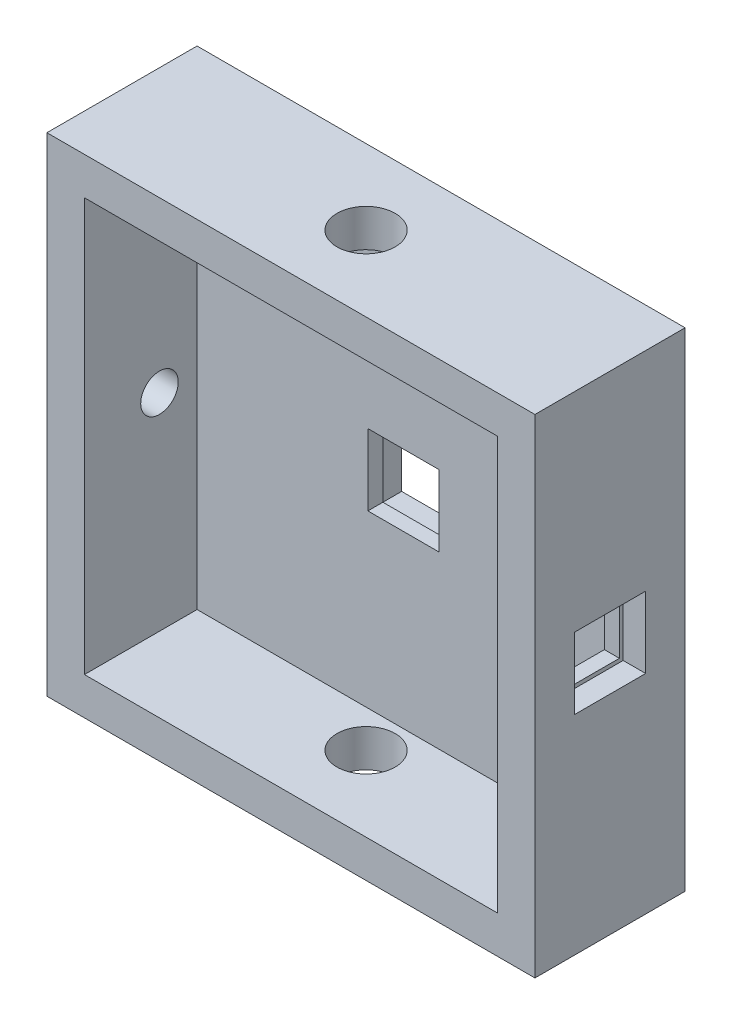
ISO-10303-21;
HEADER;
FILE_DESCRIPTION(('STEP AP214'),'2;1');
FILE_NAME('part.step','',(''),(''),'','','');
FILE_SCHEMA(('AUTOMOTIVE_DESIGN { 1 0 10303 214 1 1 1 1 }'));
ENDSEC;
DATA;
#1=APPLICATION_CONTEXT('core data for automotive mechanical design processes');
#2=APPLICATION_PROTOCOL_DEFINITION('international standard','automotive_design',2000,#1);
#3=PRODUCT_CONTEXT('',#1,'mechanical');
#4=PRODUCT('Part','Part','',(#3));
#5=PRODUCT_RELATED_PRODUCT_CATEGORY('part','',(#4));
#6=PRODUCT_DEFINITION_FORMATION('','',#4);
#7=PRODUCT_DEFINITION_CONTEXT('part definition',#1,'design');
#8=PRODUCT_DEFINITION('design','',#6,#7);
#9=PRODUCT_DEFINITION_SHAPE('','',#8);
#10=(LENGTH_UNIT() NAMED_UNIT(*) SI_UNIT(.MILLI.,.METRE.));
#11=(NAMED_UNIT(*) PLANE_ANGLE_UNIT() SI_UNIT($,.RADIAN.));
#12=(NAMED_UNIT(*) SI_UNIT($,.STERADIAN.) SOLID_ANGLE_UNIT());
#13=UNCERTAINTY_MEASURE_WITH_UNIT(LENGTH_MEASURE(1.E-05),#10,'distance_accuracy_value','');
#14=(GEOMETRIC_REPRESENTATION_CONTEXT(3) GLOBAL_UNCERTAINTY_ASSIGNED_CONTEXT((#13)) GLOBAL_UNIT_ASSIGNED_CONTEXT((#10,
#11,#12)) REPRESENTATION_CONTEXT('',''));
#15=CARTESIAN_POINT('',(0.,0.,0.));
#16=DIRECTION('',(0.,0.,1.));
#17=DIRECTION('',(1.,0.,0.));
#18=AXIS2_PLACEMENT_3D('',#15,#16,#17);
#19=CARTESIAN_POINT('',(11.,-1.7,5.7));
#20=DIRECTION('',(0.,0.,-1.));
#21=DIRECTION('',(-1.,0.,0.));
#22=AXIS2_PLACEMENT_3D('',#19,#20,#21);
#23=PLANE('',#22);
#24=DIRECTION('',(1.,0.,0.));
#25=VECTOR('',#24,1.);
#26=CARTESIAN_POINT('',(11.,1.7,5.7));
#27=LINE('',#26,#25);
#28=CARTESIAN_POINT('',(11.,1.7,5.7));
#29=VERTEX_POINT('',#28);
#30=CARTESIAN_POINT('',(11.8,1.7,5.7));
#31=VERTEX_POINT('',#30);
#32=EDGE_CURVE('E230',#29,#31,#27,.T.);
#33=ORIENTED_EDGE('',*,*,#32,.T.);
#34=DIRECTION('',(0.,-1.,0.));
#35=VECTOR('',#34,1.);
#36=CARTESIAN_POINT('',(11.8,-1.7,5.7));
#37=LINE('',#36,#35);
#38=CARTESIAN_POINT('',(11.8,-1.7,5.7));
#39=VERTEX_POINT('',#38);
#40=EDGE_CURVE('E209',#31,#39,#37,.T.);
#41=ORIENTED_EDGE('',*,*,#40,.T.);
#42=DIRECTION('',(1.,0.,0.));
#43=VECTOR('',#42,1.);
#44=CARTESIAN_POINT('',(11.,-1.7,5.7));
#45=LINE('',#44,#43);
#46=CARTESIAN_POINT('',(11.,-1.7,5.7));
#47=VERTEX_POINT('',#46);
#48=EDGE_CURVE('E236',#47,#39,#45,.T.);
#49=ORIENTED_EDGE('',*,*,#48,.F.);
#50=DIRECTION('',(0.,1.,0.));
#51=VECTOR('',#50,1.);
#52=CARTESIAN_POINT('',(11.,-1.7,5.7));
#53=LINE('',#52,#51);
#54=EDGE_CURVE('E838',#47,#29,#53,.T.);
#55=ORIENTED_EDGE('',*,*,#54,.T.);
#56=EDGE_LOOP('',(#33,#41,#49,#55));
#57=FACE_BOUND('',#56,.T.);
#58=ADVANCED_FACE('F45',(#57),#23,.T.);
#59=CARTESIAN_POINT('',(11.,1.7,5.7));
#60=DIRECTION('',(0.,-1.,0.));
#61=DIRECTION('',(1.,0.,0.));
#62=AXIS2_PLACEMENT_3D('',#59,#60,#61);
#63=PLANE('',#62);
#64=DIRECTION('',(1.,0.,0.));
#65=VECTOR('',#64,1.);
#66=CARTESIAN_POINT('',(11.,1.7,2.3));
#67=LINE('',#66,#65);
#68=CARTESIAN_POINT('',(11.,1.7,2.3));
#69=VERTEX_POINT('',#68);
#70=CARTESIAN_POINT('',(11.8,1.7,2.3));
#71=VERTEX_POINT('',#70);
#72=EDGE_CURVE('E220',#69,#71,#67,.T.);
#73=ORIENTED_EDGE('',*,*,#72,.T.);
#74=DIRECTION('',(0.,0.,1.));
#75=VECTOR('',#74,1.);
#76=CARTESIAN_POINT('',(11.8,1.7,5.7));
#77=LINE('',#76,#75);
#78=EDGE_CURVE('E205',#71,#31,#77,.T.);
#79=ORIENTED_EDGE('',*,*,#78,.T.);
#80=ORIENTED_EDGE('',*,*,#32,.F.);
#81=DIRECTION('',(0.,0.,-1.));
#82=VECTOR('',#81,1.);
#83=CARTESIAN_POINT('',(11.,1.7,5.7));
#84=LINE('',#83,#82);
#85=EDGE_CURVE('E228',#29,#69,#84,.T.);
#86=ORIENTED_EDGE('',*,*,#85,.T.);
#87=EDGE_LOOP('',(#73,#79,#80,#86));
#88=FACE_BOUND('',#87,.T.);
#89=ADVANCED_FACE('F226',(#88),#63,.T.);
#90=CARTESIAN_POINT('',(11.,-1.7,2.3));
#91=DIRECTION('',(0.,0.,-1.));
#92=DIRECTION('',(-1.,0.,0.));
#93=AXIS2_PLACEMENT_3D('',#90,#91,#92);
#94=PLANE('',#93);
#95=DIRECTION('',(0.,1.,0.));
#96=VECTOR('',#95,1.);
#97=CARTESIAN_POINT('',(11.8,-1.7,2.3));
#98=LINE('',#97,#96);
#99=CARTESIAN_POINT('',(11.8,-1.7,2.3));
#100=VERTEX_POINT('',#99);
#101=EDGE_CURVE('E70',#100,#71,#98,.T.);
#102=ORIENTED_EDGE('',*,*,#101,.T.);
#103=ORIENTED_EDGE('',*,*,#72,.F.);
#104=DIRECTION('',(0.,1.,0.));
#105=VECTOR('',#104,1.);
#106=CARTESIAN_POINT('',(11.,-1.7,2.3));
#107=LINE('',#106,#105);
#108=CARTESIAN_POINT('',(11.,-1.7,2.3));
#109=VERTEX_POINT('',#108);
#110=EDGE_CURVE('E839',#109,#69,#107,.T.);
#111=ORIENTED_EDGE('',*,*,#110,.F.);
#112=DIRECTION('',(1.,0.,0.));
#113=VECTOR('',#112,1.);
#114=CARTESIAN_POINT('',(11.,-1.7,2.3));
#115=LINE('',#114,#113);
#116=EDGE_CURVE('E223',#109,#100,#115,.T.);
#117=ORIENTED_EDGE('',*,*,#116,.T.);
#118=EDGE_LOOP('',(#102,#103,#111,#117));
#119=FACE_BOUND('',#118,.T.);
#120=ADVANCED_FACE('F219',(#119),#94,.F.);
#121=CARTESIAN_POINT('',(11.,-1.7,5.7));
#122=DIRECTION('',(0.,-1.,0.));
#123=DIRECTION('',(1.,0.,0.));
#124=AXIS2_PLACEMENT_3D('',#121,#122,#123);
#125=PLANE('',#124);
#126=DIRECTION('',(0.,0.,-1.));
#127=VECTOR('',#126,1.);
#128=CARTESIAN_POINT('',(11.8,-1.7,5.7));
#129=LINE('',#128,#127);
#130=EDGE_CURVE('E854',#39,#100,#129,.T.);
#131=ORIENTED_EDGE('',*,*,#130,.T.);
#132=ORIENTED_EDGE('',*,*,#116,.F.);
#133=DIRECTION('',(0.,0.,-1.));
#134=VECTOR('',#133,1.);
#135=CARTESIAN_POINT('',(11.,-1.7,5.7));
#136=LINE('',#135,#134);
#137=EDGE_CURVE('E844',#47,#109,#136,.T.);
#138=ORIENTED_EDGE('',*,*,#137,.F.);
#139=ORIENTED_EDGE('',*,*,#48,.T.);
#140=EDGE_LOOP('',(#131,#132,#138,#139));
#141=FACE_BOUND('',#140,.T.);
#142=ADVANCED_FACE('F613',(#141),#125,.F.);
#143=CARTESIAN_POINT('',(13.,-13.,8.));
#144=DIRECTION('',(-1.,0.,0.));
#145=DIRECTION('',(0.,-1.,0.));
#146=AXIS2_PLACEMENT_3D('',#143,#144,#145);
#147=PLANE('',#146);
#148=DIRECTION('',(0.,1.,0.));
#149=VECTOR('',#148,1.);
#150=CARTESIAN_POINT('',(13.,-1.9,2.1));
#151=LINE('',#150,#149);
#152=CARTESIAN_POINT('',(13.,-1.9,2.1));
#153=VERTEX_POINT('',#152);
#154=CARTESIAN_POINT('',(13.,1.9,2.1));
#155=VERTEX_POINT('',#154);
#156=EDGE_CURVE('E880',#153,#155,#151,.T.);
#157=ORIENTED_EDGE('',*,*,#156,.F.);
#158=DIRECTION('',(0.,0.,-1.));
#159=VECTOR('',#158,1.);
#160=CARTESIAN_POINT('',(13.,-1.9,5.9));
#161=LINE('',#160,#159);
#162=CARTESIAN_POINT('',(13.,-1.9,5.9));
#163=VERTEX_POINT('',#162);
#164=EDGE_CURVE('E62',#163,#153,#161,.T.);
#165=ORIENTED_EDGE('',*,*,#164,.F.);
#166=DIRECTION('',(0.,-1.,0.));
#167=VECTOR('',#166,1.);
#168=CARTESIAN_POINT('',(13.,-1.9,5.9));
#169=LINE('',#168,#167);
#170=CARTESIAN_POINT('',(13.,1.9,5.9));
#171=VERTEX_POINT('',#170);
#172=EDGE_CURVE('E865',#171,#163,#169,.T.);
#173=ORIENTED_EDGE('',*,*,#172,.F.);
#174=DIRECTION('',(0.,0.,1.));
#175=VECTOR('',#174,1.);
#176=CARTESIAN_POINT('',(13.,1.9,5.9));
#177=LINE('',#176,#175);
#178=EDGE_CURVE('E884',#155,#171,#177,.T.);
#179=ORIENTED_EDGE('',*,*,#178,.F.);
#180=EDGE_LOOP('',(#157,#165,#173,#179));
#181=FACE_BOUND('',#180,.T.);
#182=DIRECTION('',(0.,1.,0.));
#183=VECTOR('',#182,1.);
#184=CARTESIAN_POINT('',(13.,-13.,0.));
#185=LINE('',#184,#183);
#186=CARTESIAN_POINT('',(13.,-13.,0.));
#187=VERTEX_POINT('',#186);
#188=CARTESIAN_POINT('',(13.,13.,0.));
#189=VERTEX_POINT('',#188);
#190=EDGE_CURVE('E391',#187,#189,#185,.T.);
#191=ORIENTED_EDGE('',*,*,#190,.T.);
#192=DIRECTION('',(0.,0.,-1.));
#193=VECTOR('',#192,1.);
#194=CARTESIAN_POINT('',(13.,13.,8.));
#195=LINE('',#194,#193);
#196=CARTESIAN_POINT('',(13.,13.,8.));
#197=VERTEX_POINT('',#196);
#198=EDGE_CURVE('E406',#197,#189,#195,.T.);
#199=ORIENTED_EDGE('',*,*,#198,.F.);
#200=DIRECTION('',(0.,1.,0.));
#201=VECTOR('',#200,1.);
#202=CARTESIAN_POINT('',(13.,-13.,8.));
#203=LINE('',#202,#201);
#204=CARTESIAN_POINT('',(13.,-13.,8.));
#205=VERTEX_POINT('',#204);
#206=EDGE_CURVE('E377',#205,#197,#203,.T.);
#207=ORIENTED_EDGE('',*,*,#206,.F.);
#208=DIRECTION('',(0.,0.,-1.));
#209=VECTOR('',#208,1.);
#210=CARTESIAN_POINT('',(13.,-13.,8.));
#211=LINE('',#210,#209);
#212=EDGE_CURVE('E410',#205,#187,#211,.T.);
#213=ORIENTED_EDGE('',*,*,#212,.T.);
#214=EDGE_LOOP('',(#191,#199,#207,#213));
#215=FACE_BOUND('',#214,.T.);
#216=ADVANCED_FACE('F621',(#181,#215),#147,.F.);
#217=CARTESIAN_POINT('',(11.,-11.,8.));
#218=DIRECTION('',(-1.,0.,0.));
#219=DIRECTION('',(0.,0.,1.));
#220=AXIS2_PLACEMENT_3D('',#217,#218,#219);
#221=PLANE('',#220);
#222=DIRECTION('',(0.,1.,0.));
#223=VECTOR('',#222,1.);
#224=CARTESIAN_POINT('',(11.,0.,2.));
#225=LINE('',#224,#223);
#226=CARTESIAN_POINT('',(11.,-11.,2.));
#227=VERTEX_POINT('',#226);
#228=CARTESIAN_POINT('',(11.,11.,2.));
#229=VERTEX_POINT('',#228);
#230=EDGE_CURVE('E334',#227,#229,#225,.T.);
#231=ORIENTED_EDGE('',*,*,#230,.F.);
#232=DIRECTION('',(0.,0.,-1.));
#233=VECTOR('',#232,1.);
#234=CARTESIAN_POINT('',(11.,-11.,8.));
#235=LINE('',#234,#233);
#236=CARTESIAN_POINT('',(11.,-11.,8.));
#237=VERTEX_POINT('',#236);
#238=EDGE_CURVE('E357',#237,#227,#235,.T.);
#239=ORIENTED_EDGE('',*,*,#238,.F.);
#240=DIRECTION('',(0.,1.,0.));
#241=VECTOR('',#240,1.);
#242=CARTESIAN_POINT('',(11.,-11.,8.));
#243=LINE('',#242,#241);
#244=CARTESIAN_POINT('',(11.,11.,8.));
#245=VERTEX_POINT('',#244);
#246=EDGE_CURVE('E344',#237,#245,#243,.T.);
#247=ORIENTED_EDGE('',*,*,#246,.T.);
#248=DIRECTION('',(0.,0.,-1.));
#249=VECTOR('',#248,1.);
#250=CARTESIAN_POINT('',(11.,11.,8.));
#251=LINE('',#250,#249);
#252=EDGE_CURVE('E368',#245,#229,#251,.T.);
#253=ORIENTED_EDGE('',*,*,#252,.T.);
#254=EDGE_LOOP('',(#231,#239,#247,#253));
#255=FACE_BOUND('',#254,.T.);
#256=ORIENTED_EDGE('',*,*,#85,.F.);
#257=ORIENTED_EDGE('',*,*,#54,.F.);
#258=ORIENTED_EDGE('',*,*,#137,.T.);
#259=ORIENTED_EDGE('',*,*,#110,.T.);
#260=EDGE_LOOP('',(#256,#257,#258,#259));
#261=FACE_BOUND('',#260,.T.);
#262=ADVANCED_FACE('F631',(#255,#261),#221,.T.);
#263=CARTESIAN_POINT('',(0.,0.,0.));
#264=DIRECTION('',(0.,0.,1.));
#265=DIRECTION('',(1.,0.,0.));
#266=AXIS2_PLACEMENT_3D('',#263,#264,#265);
#267=PLANE('',#266);
#268=DIRECTION('',(1.,0.,0.));
#269=VECTOR('',#268,1.);
#270=CARTESIAN_POINT('',(-13.,-13.,0.));
#271=LINE('',#270,#269);
#272=CARTESIAN_POINT('',(-13.,-13.,0.));
#273=VERTEX_POINT('',#272);
#274=EDGE_CURVE('E372',#273,#187,#271,.T.);
#275=ORIENTED_EDGE('',*,*,#274,.F.);
#276=DIRECTION('',(0.,-1.,0.));
#277=VECTOR('',#276,1.);
#278=CARTESIAN_POINT('',(-13.,-13.,0.));
#279=LINE('',#278,#277);
#280=CARTESIAN_POINT('',(-13.,13.,0.));
#281=VERTEX_POINT('',#280);
#282=EDGE_CURVE('E378',#281,#273,#279,.T.);
#283=ORIENTED_EDGE('',*,*,#282,.F.);
#284=DIRECTION('',(-1.,0.,0.));
#285=VECTOR('',#284,1.);
#286=CARTESIAN_POINT('',(-13.,13.,0.));
#287=LINE('',#286,#285);
#288=EDGE_CURVE('E394',#189,#281,#287,.T.);
#289=ORIENTED_EDGE('',*,*,#288,.F.);
#290=ORIENTED_EDGE('',*,*,#190,.F.);
#291=EDGE_LOOP('',(#275,#283,#289,#290));
#292=FACE_BOUND('',#291,.T.);
#293=DIRECTION('',(0.,1.,0.));
#294=VECTOR('',#293,1.);
#295=CARTESIAN_POINT('',(2.1,-2.1,0.));
#296=LINE('',#295,#294);
#297=CARTESIAN_POINT('',(2.1,-2.1,0.));
#298=VERTEX_POINT('',#297);
#299=CARTESIAN_POINT('',(2.1,2.1,0.));
#300=VERTEX_POINT('',#299);
#301=EDGE_CURVE('E278',#298,#300,#296,.T.);
#302=ORIENTED_EDGE('',*,*,#301,.T.);
#303=DIRECTION('',(-1.,0.,0.));
#304=VECTOR('',#303,1.);
#305=CARTESIAN_POINT('',(-2.1,2.1,0.));
#306=LINE('',#305,#304);
#307=CARTESIAN_POINT('',(-2.1,2.1,0.));
#308=VERTEX_POINT('',#307);
#309=EDGE_CURVE('E306',#300,#308,#306,.T.);
#310=ORIENTED_EDGE('',*,*,#309,.T.);
#311=DIRECTION('',(0.,-1.,0.));
#312=VECTOR('',#311,1.);
#313=CARTESIAN_POINT('',(-2.1,-2.1,0.));
#314=LINE('',#313,#312);
#315=CARTESIAN_POINT('',(-2.1,-2.1,0.));
#316=VERTEX_POINT('',#315);
#317=EDGE_CURVE('E310',#308,#316,#314,.T.);
#318=ORIENTED_EDGE('',*,*,#317,.T.);
#319=DIRECTION('',(1.,0.,0.));
#320=VECTOR('',#319,1.);
#321=CARTESIAN_POINT('',(-2.1,-2.1,0.));
#322=LINE('',#321,#320);
#323=EDGE_CURVE('E293',#316,#298,#322,.T.);
#324=ORIENTED_EDGE('',*,*,#323,.T.);
#325=EDGE_LOOP('',(#302,#310,#318,#324));
#326=FACE_BOUND('',#325,.T.);
#327=ADVANCED_FACE('F462',(#292,#326),#267,.F.);
#328=CARTESIAN_POINT('',(0.,0.,8.));
#329=DIRECTION('',(0.,0.,1.));
#330=DIRECTION('',(1.,0.,0.));
#331=AXIS2_PLACEMENT_3D('',#328,#329,#330);
#332=PLANE('',#331);
#333=DIRECTION('',(1.,0.,0.));
#334=VECTOR('',#333,1.);
#335=CARTESIAN_POINT('',(-13.,-13.,8.));
#336=LINE('',#335,#334);
#337=CARTESIAN_POINT('',(-13.,-13.,8.));
#338=VERTEX_POINT('',#337);
#339=EDGE_CURVE('E373',#338,#205,#336,.T.);
#340=ORIENTED_EDGE('',*,*,#339,.T.);
#341=ORIENTED_EDGE('',*,*,#206,.T.);
#342=DIRECTION('',(-1.,0.,0.));
#343=VECTOR('',#342,1.);
#344=CARTESIAN_POINT('',(-13.,13.,8.));
#345=LINE('',#344,#343);
#346=CARTESIAN_POINT('',(-13.,13.,8.));
#347=VERTEX_POINT('',#346);
#348=EDGE_CURVE('E381',#197,#347,#345,.T.);
#349=ORIENTED_EDGE('',*,*,#348,.T.);
#350=DIRECTION('',(0.,-1.,0.));
#351=VECTOR('',#350,1.);
#352=CARTESIAN_POINT('',(-13.,-13.,8.));
#353=LINE('',#352,#351);
#354=EDGE_CURVE('E384',#347,#338,#353,.T.);
#355=ORIENTED_EDGE('',*,*,#354,.T.);
#356=EDGE_LOOP('',(#340,#341,#349,#355));
#357=FACE_BOUND('',#356,.T.);
#358=DIRECTION('',(-1.,0.,0.));
#359=VECTOR('',#358,1.);
#360=CARTESIAN_POINT('',(-11.,11.,8.));
#361=LINE('',#360,#359);
#362=CARTESIAN_POINT('',(-11.,11.,8.));
#363=VERTEX_POINT('',#362);
#364=EDGE_CURVE('E347',#245,#363,#361,.T.);
#365=ORIENTED_EDGE('',*,*,#364,.F.);
#366=ORIENTED_EDGE('',*,*,#246,.F.);
#367=DIRECTION('',(1.,0.,0.));
#368=VECTOR('',#367,1.);
#369=CARTESIAN_POINT('',(-11.,-11.,8.));
#370=LINE('',#369,#368);
#371=CARTESIAN_POINT('',(-11.,-11.,8.));
#372=VERTEX_POINT('',#371);
#373=EDGE_CURVE('E354',#372,#237,#370,.T.);
#374=ORIENTED_EDGE('',*,*,#373,.F.);
#375=DIRECTION('',(0.,-1.,0.));
#376=VECTOR('',#375,1.);
#377=CARTESIAN_POINT('',(-11.,-11.,8.));
#378=LINE('',#377,#376);
#379=EDGE_CURVE('E350',#363,#372,#378,.T.);
#380=ORIENTED_EDGE('',*,*,#379,.F.);
#381=EDGE_LOOP('',(#365,#366,#374,#380));
#382=FACE_BOUND('',#381,.T.);
#383=ADVANCED_FACE('F712',(#357,#382),#332,.T.);
#384=CARTESIAN_POINT('',(-13.,-13.,8.));
#385=DIRECTION('',(0.,1.,0.));
#386=DIRECTION('',(0.,0.,1.));
#387=AXIS2_PLACEMENT_3D('',#384,#385,#386);
#388=PLANE('',#387);
#389=CARTESIAN_POINT('',(-0.00435538032722213,-13.,3.99223783635204));
#390=DIRECTION('',(0.,1.,0.));
#391=DIRECTION('',(-1.,0.,0.));
#392=AXIS2_PLACEMENT_3D('',#389,#390,#391);
#393=CIRCLE('',#392,1.55);
#394=CARTESIAN_POINT('',(-1.55435538032722,-13.,3.99223783635204));
#395=VERTEX_POINT('',#394);
#396=EDGE_CURVE('E248',#395,#395,#393,.T.);
#397=ORIENTED_EDGE('',*,*,#396,.T.);
#398=EDGE_LOOP('',(#397));
#399=FACE_BOUND('',#398,.T.);
#400=ORIENTED_EDGE('',*,*,#274,.T.);
#401=ORIENTED_EDGE('',*,*,#212,.F.);
#402=ORIENTED_EDGE('',*,*,#339,.F.);
#403=DIRECTION('',(0.,0.,-1.));
#404=VECTOR('',#403,1.);
#405=CARTESIAN_POINT('',(-13.,-13.,8.));
#406=LINE('',#405,#404);
#407=EDGE_CURVE('E387',#338,#273,#406,.T.);
#408=ORIENTED_EDGE('',*,*,#407,.T.);
#409=EDGE_LOOP('',(#400,#401,#402,#408));
#410=FACE_BOUND('',#409,.T.);
#411=ADVANCED_FACE('F47',(#399,#410),#388,.F.);
#412=CARTESIAN_POINT('',(-13.,13.,8.));
#413=DIRECTION('',(0.,-1.,0.));
#414=DIRECTION('',(1.,0.,0.));
#415=AXIS2_PLACEMENT_3D('',#412,#413,#414);
#416=PLANE('',#415);
#417=CARTESIAN_POINT('',(-0.00435538032722387,13.,3.99223783635204));
#418=DIRECTION('',(0.,1.,0.));
#419=DIRECTION('',(-1.,0.,0.));
#420=AXIS2_PLACEMENT_3D('',#417,#418,#419);
#421=CIRCLE('',#420,1.55);
#422=CARTESIAN_POINT('',(-1.55435538032722,13.,3.99223783635204));
#423=VERTEX_POINT('',#422);
#424=EDGE_CURVE('E244',#423,#423,#421,.T.);
#425=ORIENTED_EDGE('',*,*,#424,.F.);
#426=EDGE_LOOP('',(#425));
#427=FACE_BOUND('',#426,.T.);
#428=ORIENTED_EDGE('',*,*,#288,.T.);
#429=DIRECTION('',(0.,0.,-1.));
#430=VECTOR('',#429,1.);
#431=CARTESIAN_POINT('',(-13.,13.,8.));
#432=LINE('',#431,#430);
#433=EDGE_CURVE('E402',#347,#281,#432,.T.);
#434=ORIENTED_EDGE('',*,*,#433,.F.);
#435=ORIENTED_EDGE('',*,*,#348,.F.);
#436=ORIENTED_EDGE('',*,*,#198,.T.);
#437=EDGE_LOOP('',(#428,#434,#435,#436));
#438=FACE_BOUND('',#437,.T.);
#439=ADVANCED_FACE('F761',(#427,#438),#416,.F.);
#440=CARTESIAN_POINT('',(-13.,-13.,8.));
#441=DIRECTION('',(1.,0.,0.));
#442=DIRECTION('',(0.,0.,-1.));
#443=AXIS2_PLACEMENT_3D('',#440,#441,#442);
#444=PLANE('',#443);
#445=CARTESIAN_POINT('',(-13.,0.00439716610721987,4.0022983558996));
#446=DIRECTION('',(-1.,0.,0.));
#447=DIRECTION('',(0.,0.,1.));
#448=AXIS2_PLACEMENT_3D('',#445,#446,#447);
#449=CIRCLE('',#448,1.);
#450=CARTESIAN_POINT('',(-13.,0.00439716610721987,5.0022983558996));
#451=VERTEX_POINT('',#450);
#452=EDGE_CURVE('E234',#451,#451,#449,.T.);
#453=ORIENTED_EDGE('',*,*,#452,.F.);
#454=EDGE_LOOP('',(#453));
#455=FACE_BOUND('',#454,.T.);
#456=ORIENTED_EDGE('',*,*,#282,.T.);
#457=ORIENTED_EDGE('',*,*,#407,.F.);
#458=ORIENTED_EDGE('',*,*,#354,.F.);
#459=ORIENTED_EDGE('',*,*,#433,.T.);
#460=EDGE_LOOP('',(#456,#457,#458,#459));
#461=FACE_BOUND('',#460,.T.);
#462=ADVANCED_FACE('F751',(#455,#461),#444,.F.);
#463=CARTESIAN_POINT('',(-11.,11.,8.));
#464=DIRECTION('',(0.,-1.,0.));
#465=DIRECTION('',(0.,0.,-1.));
#466=AXIS2_PLACEMENT_3D('',#463,#464,#465);
#467=PLANE('',#466);
#468=CARTESIAN_POINT('',(-0.00435538032722373,11.,3.99223783635204));
#469=DIRECTION('',(0.,-1.,0.));
#470=DIRECTION('',(0.,0.,-1.));
#471=AXIS2_PLACEMENT_3D('',#468,#469,#470);
#472=CIRCLE('',#471,1.55);
#473=CARTESIAN_POINT('',(-1.55435538032722,11.,3.99223783635204));
#474=VERTEX_POINT('',#473);
#475=EDGE_CURVE('E255',#474,#474,#472,.T.);
#476=ORIENTED_EDGE('',*,*,#475,.F.);
#477=EDGE_LOOP('',(#476));
#478=FACE_BOUND('',#477,.T.);
#479=DIRECTION('',(1.,0.,0.));
#480=VECTOR('',#479,1.);
#481=CARTESIAN_POINT('',(0.,11.,2.));
#482=LINE('',#481,#480);
#483=CARTESIAN_POINT('',(-11.,11.,2.));
#484=VERTEX_POINT('',#483);
#485=EDGE_CURVE('E338',#484,#229,#482,.T.);
#486=ORIENTED_EDGE('',*,*,#485,.T.);
#487=ORIENTED_EDGE('',*,*,#252,.F.);
#488=ORIENTED_EDGE('',*,*,#364,.T.);
#489=DIRECTION('',(0.,0.,-1.));
#490=VECTOR('',#489,1.);
#491=CARTESIAN_POINT('',(-11.,11.,8.));
#492=LINE('',#491,#490);
#493=EDGE_CURVE('E364',#363,#484,#492,.T.);
#494=ORIENTED_EDGE('',*,*,#493,.T.);
#495=EDGE_LOOP('',(#486,#487,#488,#494));
#496=FACE_BOUND('',#495,.T.);
#497=ADVANCED_FACE('F742',(#478,#496),#467,.T.);
#498=CARTESIAN_POINT('',(-11.,-11.,8.));
#499=DIRECTION('',(1.,0.,0.));
#500=DIRECTION('',(0.,0.,-1.));
#501=AXIS2_PLACEMENT_3D('',#498,#499,#500);
#502=PLANE('',#501);
#503=CARTESIAN_POINT('',(-11.,0.00439716610721987,4.0022983558996));
#504=DIRECTION('',(-1.,0.,0.));
#505=DIRECTION('',(0.,0.,1.));
#506=AXIS2_PLACEMENT_3D('',#503,#504,#505);
#507=CIRCLE('',#506,1.);
#508=CARTESIAN_POINT('',(-11.,0.00439716610721987,5.0022983558996));
#509=VERTEX_POINT('',#508);
#510=EDGE_CURVE('E240',#509,#509,#507,.T.);
#511=ORIENTED_EDGE('',*,*,#510,.T.);
#512=EDGE_LOOP('',(#511));
#513=FACE_BOUND('',#512,.T.);
#514=DIRECTION('',(0.,1.,0.));
#515=VECTOR('',#514,1.);
#516=CARTESIAN_POINT('',(-11.,0.,2.));
#517=LINE('',#516,#515);
#518=CARTESIAN_POINT('',(-11.,-11.,2.));
#519=VERTEX_POINT('',#518);
#520=EDGE_CURVE('E341',#519,#484,#517,.T.);
#521=ORIENTED_EDGE('',*,*,#520,.T.);
#522=ORIENTED_EDGE('',*,*,#493,.F.);
#523=ORIENTED_EDGE('',*,*,#379,.T.);
#524=DIRECTION('',(0.,0.,-1.));
#525=VECTOR('',#524,1.);
#526=CARTESIAN_POINT('',(-11.,-11.,8.));
#527=LINE('',#526,#525);
#528=EDGE_CURVE('E360',#372,#519,#527,.T.);
#529=ORIENTED_EDGE('',*,*,#528,.T.);
#530=EDGE_LOOP('',(#521,#522,#523,#529));
#531=FACE_BOUND('',#530,.T.);
#532=ADVANCED_FACE('F733',(#513,#531),#502,.T.);
#533=CARTESIAN_POINT('',(-11.,-11.,8.));
#534=DIRECTION('',(0.,1.,0.));
#535=DIRECTION('',(0.,0.,1.));
#536=AXIS2_PLACEMENT_3D('',#533,#534,#535);
#537=PLANE('',#536);
#538=CARTESIAN_POINT('',(-0.00435538032722226,-11.,3.99223783635204));
#539=DIRECTION('',(0.,1.,0.));
#540=DIRECTION('',(0.,0.,1.));
#541=AXIS2_PLACEMENT_3D('',#538,#539,#540);
#542=CIRCLE('',#541,1.55);
#543=CARTESIAN_POINT('',(-1.55435538032722,-11.,3.99223783635204));
#544=VERTEX_POINT('',#543);
#545=EDGE_CURVE('E49',#544,#544,#542,.T.);
#546=ORIENTED_EDGE('',*,*,#545,.F.);
#547=EDGE_LOOP('',(#546));
#548=FACE_BOUND('',#547,.T.);
#549=DIRECTION('',(1.,0.,0.));
#550=VECTOR('',#549,1.);
#551=CARTESIAN_POINT('',(0.,-11.,2.));
#552=LINE('',#551,#550);
#553=EDGE_CURVE('E330',#519,#227,#552,.T.);
#554=ORIENTED_EDGE('',*,*,#553,.F.);
#555=ORIENTED_EDGE('',*,*,#528,.F.);
#556=ORIENTED_EDGE('',*,*,#373,.T.);
#557=ORIENTED_EDGE('',*,*,#238,.T.);
#558=EDGE_LOOP('',(#554,#555,#556,#557));
#559=FACE_BOUND('',#558,.T.);
#560=ADVANCED_FACE('F725',(#548,#559),#537,.T.);
#561=CARTESIAN_POINT('',(0.,0.,2.));
#562=DIRECTION('',(0.,0.,1.));
#563=DIRECTION('',(1.,0.,0.));
#564=AXIS2_PLACEMENT_3D('',#561,#562,#563);
#565=PLANE('',#564);
#566=DIRECTION('',(0.,-1.,0.));
#567=VECTOR('',#566,1.);
#568=CARTESIAN_POINT('',(-1.9,0.,2.));
#569=LINE('',#568,#567);
#570=CARTESIAN_POINT('',(-1.9,1.9,2.));
#571=VERTEX_POINT('',#570);
#572=CARTESIAN_POINT('',(-1.9,-1.9,2.));
#573=VERTEX_POINT('',#572);
#574=EDGE_CURVE('E11',#571,#573,#569,.T.);
#575=ORIENTED_EDGE('',*,*,#574,.F.);
#576=DIRECTION('',(-1.,0.,0.));
#577=VECTOR('',#576,1.);
#578=CARTESIAN_POINT('',(0.,1.9,2.));
#579=LINE('',#578,#577);
#580=CARTESIAN_POINT('',(1.9,1.9,2.));
#581=VERTEX_POINT('',#580);
#582=EDGE_CURVE('E414',#581,#571,#579,.T.);
#583=ORIENTED_EDGE('',*,*,#582,.F.);
#584=DIRECTION('',(0.,1.,0.));
#585=VECTOR('',#584,1.);
#586=CARTESIAN_POINT('',(1.9,0.,2.));
#587=LINE('',#586,#585);
#588=CARTESIAN_POINT('',(1.9,-1.9,2.));
#589=VERTEX_POINT('',#588);
#590=EDGE_CURVE('E417',#589,#581,#587,.T.);
#591=ORIENTED_EDGE('',*,*,#590,.F.);
#592=DIRECTION('',(1.,0.,0.));
#593=VECTOR('',#592,1.);
#594=CARTESIAN_POINT('',(0.,-1.9,2.));
#595=LINE('',#594,#593);
#596=EDGE_CURVE('E55',#573,#589,#595,.T.);
#597=ORIENTED_EDGE('',*,*,#596,.F.);
#598=EDGE_LOOP('',(#575,#583,#591,#597));
#599=FACE_BOUND('',#598,.T.);
#600=ORIENTED_EDGE('',*,*,#553,.T.);
#601=ORIENTED_EDGE('',*,*,#230,.T.);
#602=ORIENTED_EDGE('',*,*,#485,.F.);
#603=ORIENTED_EDGE('',*,*,#520,.F.);
#604=EDGE_LOOP('',(#600,#601,#602,#603));
#605=FACE_BOUND('',#604,.T.);
#606=ADVANCED_FACE('F435',(#599,#605),#565,.T.);
#607=CARTESIAN_POINT('',(2.1,-2.1,1.2));
#608=DIRECTION('',(-1.,0.,0.));
#609=DIRECTION('',(0.,0.,1.));
#610=AXIS2_PLACEMENT_3D('',#607,#608,#609);
#611=PLANE('',#610);
#612=ORIENTED_EDGE('',*,*,#301,.F.);
#613=DIRECTION('',(0.,0.,-1.));
#614=VECTOR('',#613,1.);
#615=CARTESIAN_POINT('',(2.1,-2.1,1.2));
#616=LINE('',#615,#614);
#617=CARTESIAN_POINT('',(2.1,-2.1,1.2));
#618=VERTEX_POINT('',#617);
#619=EDGE_CURVE('E302',#618,#298,#616,.T.);
#620=ORIENTED_EDGE('',*,*,#619,.F.);
#621=DIRECTION('',(0.,1.,0.));
#622=VECTOR('',#621,1.);
#623=CARTESIAN_POINT('',(2.1,-2.1,1.2));
#624=LINE('',#623,#622);
#625=CARTESIAN_POINT('',(2.1,2.1,1.2));
#626=VERTEX_POINT('',#625);
#627=EDGE_CURVE('E288',#618,#626,#624,.T.);
#628=ORIENTED_EDGE('',*,*,#627,.T.);
#629=DIRECTION('',(0.,0.,-1.));
#630=VECTOR('',#629,1.);
#631=CARTESIAN_POINT('',(2.1,2.1,1.2));
#632=LINE('',#631,#630);
#633=EDGE_CURVE('E326',#626,#300,#632,.T.);
#634=ORIENTED_EDGE('',*,*,#633,.T.);
#635=EDGE_LOOP('',(#612,#620,#628,#634));
#636=FACE_BOUND('',#635,.T.);
#637=ADVANCED_FACE('F456',(#636),#611,.T.);
#638=CARTESIAN_POINT('',(-2.1,2.1,1.2));
#639=DIRECTION('',(0.,-1.,0.));
#640=DIRECTION('',(0.,0.,-1.));
#641=AXIS2_PLACEMENT_3D('',#638,#639,#640);
#642=PLANE('',#641);
#643=ORIENTED_EDGE('',*,*,#309,.F.);
#644=ORIENTED_EDGE('',*,*,#633,.F.);
#645=DIRECTION('',(-1.,0.,0.));
#646=VECTOR('',#645,1.);
#647=CARTESIAN_POINT('',(-2.1,2.1,1.2));
#648=LINE('',#647,#646);
#649=CARTESIAN_POINT('',(-2.1,2.1,1.2));
#650=VERTEX_POINT('',#649);
#651=EDGE_CURVE('E292',#626,#650,#648,.T.);
#652=ORIENTED_EDGE('',*,*,#651,.T.);
#653=DIRECTION('',(0.,0.,-1.));
#654=VECTOR('',#653,1.);
#655=CARTESIAN_POINT('',(-2.1,2.1,1.2));
#656=LINE('',#655,#654);
#657=EDGE_CURVE('E323',#650,#308,#656,.T.);
#658=ORIENTED_EDGE('',*,*,#657,.T.);
#659=EDGE_LOOP('',(#643,#644,#652,#658));
#660=FACE_BOUND('',#659,.T.);
#661=ADVANCED_FACE('F458',(#660),#642,.T.);
#662=CARTESIAN_POINT('',(-2.1,-2.1,1.2));
#663=DIRECTION('',(1.,0.,0.));
#664=DIRECTION('',(0.,0.,-1.));
#665=AXIS2_PLACEMENT_3D('',#662,#663,#664);
#666=PLANE('',#665);
#667=ORIENTED_EDGE('',*,*,#317,.F.);
#668=ORIENTED_EDGE('',*,*,#657,.F.);
#669=DIRECTION('',(0.,-1.,0.));
#670=VECTOR('',#669,1.);
#671=CARTESIAN_POINT('',(-2.1,-2.1,1.2));
#672=LINE('',#671,#670);
#673=CARTESIAN_POINT('',(-2.1,-2.1,1.2));
#674=VERTEX_POINT('',#673);
#675=EDGE_CURVE('E296',#650,#674,#672,.T.);
#676=ORIENTED_EDGE('',*,*,#675,.T.);
#677=DIRECTION('',(0.,0.,-1.));
#678=VECTOR('',#677,1.);
#679=CARTESIAN_POINT('',(-2.1,-2.1,1.2));
#680=LINE('',#679,#678);
#681=EDGE_CURVE('E320',#674,#316,#680,.T.);
#682=ORIENTED_EDGE('',*,*,#681,.T.);
#683=EDGE_LOOP('',(#667,#668,#676,#682));
#684=FACE_BOUND('',#683,.T.);
#685=ADVANCED_FACE('F467',(#684),#666,.T.);
#686=CARTESIAN_POINT('',(-2.1,-2.1,1.2));
#687=DIRECTION('',(0.,1.,0.));
#688=DIRECTION('',(0.,0.,1.));
#689=AXIS2_PLACEMENT_3D('',#686,#687,#688);
#690=PLANE('',#689);
#691=ORIENTED_EDGE('',*,*,#323,.F.);
#692=ORIENTED_EDGE('',*,*,#681,.F.);
#693=DIRECTION('',(1.,0.,0.));
#694=VECTOR('',#693,1.);
#695=CARTESIAN_POINT('',(-2.1,-2.1,1.2));
#696=LINE('',#695,#694);
#697=EDGE_CURVE('E299',#674,#618,#696,.T.);
#698=ORIENTED_EDGE('',*,*,#697,.T.);
#699=ORIENTED_EDGE('',*,*,#619,.T.);
#700=EDGE_LOOP('',(#691,#692,#698,#699));
#701=FACE_BOUND('',#700,.T.);
#702=ADVANCED_FACE('F448',(#701),#690,.T.);
#703=CARTESIAN_POINT('',(0.,0.,1.2));
#704=DIRECTION('',(0.,0.,-1.));
#705=DIRECTION('',(-1.,0.,0.));
#706=AXIS2_PLACEMENT_3D('',#703,#704,#705);
#707=PLANE('',#706);
#708=DIRECTION('',(0.,1.,0.));
#709=VECTOR('',#708,1.);
#710=CARTESIAN_POINT('',(-1.9,-1.9,1.2));
#711=LINE('',#710,#709);
#712=CARTESIAN_POINT('',(-1.9,-1.9,1.2));
#713=VERTEX_POINT('',#712);
#714=CARTESIAN_POINT('',(-1.9,1.9,1.2));
#715=VERTEX_POINT('',#714);
#716=EDGE_CURVE('E259',#713,#715,#711,.T.);
#717=ORIENTED_EDGE('',*,*,#716,.F.);
#718=DIRECTION('',(-1.,0.,0.));
#719=VECTOR('',#718,1.);
#720=CARTESIAN_POINT('',(1.9,-1.9,1.2));
#721=LINE('',#720,#719);
#722=CARTESIAN_POINT('',(1.9,-1.9,1.2));
#723=VERTEX_POINT('',#722);
#724=EDGE_CURVE('E270',#723,#713,#721,.T.);
#725=ORIENTED_EDGE('',*,*,#724,.F.);
#726=DIRECTION('',(0.,-1.,0.));
#727=VECTOR('',#726,1.);
#728=CARTESIAN_POINT('',(1.9,-1.9,1.2));
#729=LINE('',#728,#727);
#730=CARTESIAN_POINT('',(1.9,1.9,1.2));
#731=VERTEX_POINT('',#730);
#732=EDGE_CURVE('E267',#731,#723,#729,.T.);
#733=ORIENTED_EDGE('',*,*,#732,.F.);
#734=DIRECTION('',(1.,0.,0.));
#735=VECTOR('',#734,1.);
#736=CARTESIAN_POINT('',(1.9,1.9,1.2));
#737=LINE('',#736,#735);
#738=EDGE_CURVE('E263',#715,#731,#737,.T.);
#739=ORIENTED_EDGE('',*,*,#738,.F.);
#740=EDGE_LOOP('',(#717,#725,#733,#739));
#741=FACE_BOUND('',#740,.T.);
#742=ORIENTED_EDGE('',*,*,#627,.F.);
#743=ORIENTED_EDGE('',*,*,#697,.F.);
#744=ORIENTED_EDGE('',*,*,#675,.F.);
#745=ORIENTED_EDGE('',*,*,#651,.F.);
#746=EDGE_LOOP('',(#742,#743,#744,#745));
#747=FACE_BOUND('',#746,.T.);
#748=ADVANCED_FACE('F445',(#741,#747),#707,.T.);
#749=CARTESIAN_POINT('',(-1.9,-1.9,3.2));
#750=DIRECTION('',(-1.,0.,0.));
#751=DIRECTION('',(0.,0.,1.));
#752=AXIS2_PLACEMENT_3D('',#749,#750,#751);
#753=PLANE('',#752);
#754=ORIENTED_EDGE('',*,*,#574,.T.);
#755=DIRECTION('',(0.,0.,-1.));
#756=VECTOR('',#755,1.);
#757=CARTESIAN_POINT('',(-1.9,-1.9,3.2));
#758=LINE('',#757,#756);
#759=EDGE_CURVE('E275',#573,#713,#758,.T.);
#760=ORIENTED_EDGE('',*,*,#759,.T.);
#761=ORIENTED_EDGE('',*,*,#716,.T.);
#762=DIRECTION('',(0.,0.,-1.));
#763=VECTOR('',#762,1.);
#764=CARTESIAN_POINT('',(-1.9,1.9,3.2));
#765=LINE('',#764,#763);
#766=EDGE_CURVE('E274',#571,#715,#765,.T.);
#767=ORIENTED_EDGE('',*,*,#766,.F.);
#768=EDGE_LOOP('',(#754,#760,#761,#767));
#769=FACE_BOUND('',#768,.T.);
#770=ADVANCED_FACE('F441',(#769),#753,.F.);
#771=CARTESIAN_POINT('',(1.9,-1.9,3.2));
#772=DIRECTION('',(0.,-1.,0.));
#773=DIRECTION('',(0.,0.,-1.));
#774=AXIS2_PLACEMENT_3D('',#771,#772,#773);
#775=PLANE('',#774);
#776=ORIENTED_EDGE('',*,*,#596,.T.);
#777=DIRECTION('',(0.,0.,-1.));
#778=VECTOR('',#777,1.);
#779=CARTESIAN_POINT('',(1.9,-1.9,3.2));
#780=LINE('',#779,#778);
#781=EDGE_CURVE('E279',#589,#723,#780,.T.);
#782=ORIENTED_EDGE('',*,*,#781,.T.);
#783=ORIENTED_EDGE('',*,*,#724,.T.);
#784=ORIENTED_EDGE('',*,*,#759,.F.);
#785=EDGE_LOOP('',(#776,#782,#783,#784));
#786=FACE_BOUND('',#785,.T.);
#787=ADVANCED_FACE('F426',(#786),#775,.F.);
#788=CARTESIAN_POINT('',(1.9,-1.9,3.2));
#789=DIRECTION('',(1.,0.,0.));
#790=DIRECTION('',(0.,0.,-1.));
#791=AXIS2_PLACEMENT_3D('',#788,#789,#790);
#792=PLANE('',#791);
#793=ORIENTED_EDGE('',*,*,#590,.T.);
#794=DIRECTION('',(0.,0.,-1.));
#795=VECTOR('',#794,1.);
#796=CARTESIAN_POINT('',(1.9,1.9,3.2));
#797=LINE('',#796,#795);
#798=EDGE_CURVE('E283',#581,#731,#797,.T.);
#799=ORIENTED_EDGE('',*,*,#798,.T.);
#800=ORIENTED_EDGE('',*,*,#732,.T.);
#801=ORIENTED_EDGE('',*,*,#781,.F.);
#802=EDGE_LOOP('',(#793,#799,#800,#801));
#803=FACE_BOUND('',#802,.T.);
#804=ADVANCED_FACE('F432',(#803),#792,.F.);
#805=CARTESIAN_POINT('',(1.9,1.9,3.2));
#806=DIRECTION('',(0.,1.,0.));
#807=DIRECTION('',(0.,0.,1.));
#808=AXIS2_PLACEMENT_3D('',#805,#806,#807);
#809=PLANE('',#808);
#810=ORIENTED_EDGE('',*,*,#582,.T.);
#811=ORIENTED_EDGE('',*,*,#766,.T.);
#812=ORIENTED_EDGE('',*,*,#738,.T.);
#813=ORIENTED_EDGE('',*,*,#798,.F.);
#814=EDGE_LOOP('',(#810,#811,#812,#813));
#815=FACE_BOUND('',#814,.T.);
#816=ADVANCED_FACE('F439',(#815),#809,.F.);
#817=CARTESIAN_POINT('',(-0.00435538032722213,-13.,3.99223783635204));
#818=DIRECTION('',(0.,1.,0.));
#819=DIRECTION('',(-1.,0.,0.));
#820=AXIS2_PLACEMENT_3D('',#817,#818,#819);
#821=CYLINDRICAL_SURFACE('',#820,1.55);
#822=CARTESIAN_POINT('',(-1.55435538032722,-11.,3.99223783635204));
#823=CARTESIAN_POINT('',(-1.55435538032722,-11.0208333333333,3.99223783635204));
#824=CARTESIAN_POINT('',(-1.55435538032722,-11.0416666666667,3.99223783635204));
#825=CARTESIAN_POINT('',(-1.55435538032722,-11.0833333333333,3.99223783635204));
#826=CARTESIAN_POINT('',(-1.55435538032722,-11.1041666666667,3.99223783635204));
#827=CARTESIAN_POINT('',(-1.55435538032722,-11.1458333333333,3.99223783635204));
#828=CARTESIAN_POINT('',(-1.55435538032722,-11.1666666666667,3.99223783635204));
#829=CARTESIAN_POINT('',(-1.55435538032722,-11.2083333333333,3.99223783635204));
#830=CARTESIAN_POINT('',(-1.55435538032722,-11.2291666666667,3.99223783635204));
#831=CARTESIAN_POINT('',(-1.55435538032722,-11.2708333333333,3.99223783635204));
#832=CARTESIAN_POINT('',(-1.55435538032722,-11.2916666666667,3.99223783635204));
#833=CARTESIAN_POINT('',(-1.55435538032722,-11.3333333333333,3.99223783635204));
#834=CARTESIAN_POINT('',(-1.55435538032722,-11.3541666666667,3.99223783635204));
#835=CARTESIAN_POINT('',(-1.55435538032722,-11.3958333333333,3.99223783635204));
#836=CARTESIAN_POINT('',(-1.55435538032722,-11.4166666666667,3.99223783635204));
#837=CARTESIAN_POINT('',(-1.55435538032722,-11.4583333333333,3.99223783635204));
#838=CARTESIAN_POINT('',(-1.55435538032722,-11.4791666666667,3.99223783635204));
#839=CARTESIAN_POINT('',(-1.55435538032722,-11.5208333333333,3.99223783635204));
#840=CARTESIAN_POINT('',(-1.55435538032722,-11.5416666666667,3.99223783635204));
#841=CARTESIAN_POINT('',(-1.55435538032722,-11.5833333333333,3.99223783635204));
#842=CARTESIAN_POINT('',(-1.55435538032722,-11.6041666666667,3.99223783635204));
#843=CARTESIAN_POINT('',(-1.55435538032722,-11.6458333333333,3.99223783635204));
#844=CARTESIAN_POINT('',(-1.55435538032722,-11.6666666666667,3.99223783635204));
#845=CARTESIAN_POINT('',(-1.55435538032722,-11.7083333333333,3.99223783635204));
#846=CARTESIAN_POINT('',(-1.55435538032722,-11.7291666666667,3.99223783635204));
#847=CARTESIAN_POINT('',(-1.55435538032722,-11.7708333333333,3.99223783635204));
#848=CARTESIAN_POINT('',(-1.55435538032722,-11.7916666666667,3.99223783635204));
#849=CARTESIAN_POINT('',(-1.55435538032722,-11.8333333333333,3.99223783635204));
#850=CARTESIAN_POINT('',(-1.55435538032722,-11.8541666666667,3.99223783635204));
#851=CARTESIAN_POINT('',(-1.55435538032722,-11.8958333333333,3.99223783635204));
#852=CARTESIAN_POINT('',(-1.55435538032722,-11.9166666666667,3.99223783635204));
#853=CARTESIAN_POINT('',(-1.55435538032722,-11.9583333333333,3.99223783635204));
#854=CARTESIAN_POINT('',(-1.55435538032722,-11.9791666666667,3.99223783635204));
#855=CARTESIAN_POINT('',(-1.55435538032722,-12.0208333333333,3.99223783635204));
#856=CARTESIAN_POINT('',(-1.55435538032722,-12.0416666666667,3.99223783635204));
#857=CARTESIAN_POINT('',(-1.55435538032722,-12.0833333333333,3.99223783635204));
#858=CARTESIAN_POINT('',(-1.55435538032722,-12.1041666666667,3.99223783635204));
#859=CARTESIAN_POINT('',(-1.55435538032722,-12.1458333333333,3.99223783635204));
#860=CARTESIAN_POINT('',(-1.55435538032722,-12.1666666666667,3.99223783635204));
#861=CARTESIAN_POINT('',(-1.55435538032722,-12.2083333333333,3.99223783635204));
#862=CARTESIAN_POINT('',(-1.55435538032722,-12.2291666666667,3.99223783635204));
#863=CARTESIAN_POINT('',(-1.55435538032722,-12.2708333333333,3.99223783635204));
#864=CARTESIAN_POINT('',(-1.55435538032722,-12.2916666666667,3.99223783635204));
#865=CARTESIAN_POINT('',(-1.55435538032722,-12.3333333333333,3.99223783635204));
#866=CARTESIAN_POINT('',(-1.55435538032722,-12.3541666666667,3.99223783635204));
#867=CARTESIAN_POINT('',(-1.55435538032722,-12.3958333333333,3.99223783635204));
#868=CARTESIAN_POINT('',(-1.55435538032722,-12.4166666666667,3.99223783635204));
#869=CARTESIAN_POINT('',(-1.55435538032722,-12.4583333333333,3.99223783635204));
#870=CARTESIAN_POINT('',(-1.55435538032722,-12.4791666666667,3.99223783635204));
#871=CARTESIAN_POINT('',(-1.55435538032722,-12.5208333333333,3.99223783635204));
#872=CARTESIAN_POINT('',(-1.55435538032722,-12.5416666666667,3.99223783635204));
#873=CARTESIAN_POINT('',(-1.55435538032722,-12.5833333333333,3.99223783635204));
#874=CARTESIAN_POINT('',(-1.55435538032722,-12.6041666666667,3.99223783635204));
#875=CARTESIAN_POINT('',(-1.55435538032722,-12.6458333333333,3.99223783635204));
#876=CARTESIAN_POINT('',(-1.55435538032722,-12.6666666666667,3.99223783635204));
#877=CARTESIAN_POINT('',(-1.55435538032722,-12.7083333333333,3.99223783635204));
#878=CARTESIAN_POINT('',(-1.55435538032722,-12.7291666666667,3.99223783635204));
#879=CARTESIAN_POINT('',(-1.55435538032722,-12.7708333333333,3.99223783635204));
#880=CARTESIAN_POINT('',(-1.55435538032722,-12.7916666666667,3.99223783635204));
#881=CARTESIAN_POINT('',(-1.55435538032722,-12.8333333333333,3.99223783635204));
#882=CARTESIAN_POINT('',(-1.55435538032722,-12.8541666666667,3.99223783635204));
#883=CARTESIAN_POINT('',(-1.55435538032722,-12.8958333333333,3.99223783635204));
#884=CARTESIAN_POINT('',(-1.55435538032722,-12.9166666666667,3.99223783635204));
#885=CARTESIAN_POINT('',(-1.55435538032722,-12.9583333333333,3.99223783635204));
#886=CARTESIAN_POINT('',(-1.55435538032722,-12.9791666666667,3.99223783635204));
#887=CARTESIAN_POINT('',(-1.55435538032722,-13.,3.99223783635204));
#888=B_SPLINE_CURVE_WITH_KNOTS('',3,(#822,#823,#824,#825,#826,#827,#828,#829,#830,#831,#832,
#833,#834,#835,#836,#837,#838,#839,#840,#841,#842,#843,#844,#845,#846,#847,#848,#849,#850,#851,
#852,#853,#854,#855,#856,#857,#858,#859,#860,#861,#862,#863,#864,#865,#866,#867,#868,#869,#870,
#871,#872,#873,#874,#875,#876,#877,#878,#879,#880,#881,#882,#883,#884,#885,#886,#887),
.UNSPECIFIED.,.F.,.F.,(4,2,2,2,2,2,2,2,2,2,2,2,2,2,2,2,2,2,2,2,2,2,2,2,2,2,2,2,2,2,2,2,4),(0.,
0.0625000000000001,0.124999999999998,0.187499999999998,0.249999999999999,0.312499999999999,
0.374999999999999,0.437499999999999,0.499999999999999,0.562499999999999,0.624999999999999,
0.687499999999999,0.749999999999999,0.812499999999999,0.874999999999999,0.937499999999999,
0.999999999999999,1.0625,1.125,1.1875,1.25,1.3125,1.375,1.4375,1.5,1.5625,1.625,1.6875,1.75,
1.8125,1.875,1.9375,2.),.UNSPECIFIED.);
#889=EDGE_CURVE('BSEAM491',#544,#395,#888,.T.);
#890=ORIENTED_EDGE('',*,*,#545,.T.);
#891=ORIENTED_EDGE('',*,*,#396,.F.);
#892=ORIENTED_EDGE('',*,*,#889,.T.);
#893=ORIENTED_EDGE('',*,*,#889,.F.);
#894=EDGE_LOOP('',(#890,#892,#891,#893));
#895=FACE_BOUND('',#894,.T.);
#896=ADVANCED_FACE('F491',(#895),#821,.F.);
#897=CARTESIAN_POINT('',(-1.55435538032722,11.,3.99223783635204));
#898=CARTESIAN_POINT('',(-1.55435538032722,11.0208333333333,3.99223783635204));
#899=CARTESIAN_POINT('',(-1.55435538032722,11.0416666666667,3.99223783635204));
#900=CARTESIAN_POINT('',(-1.55435538032722,11.0833333333333,3.99223783635204));
#901=CARTESIAN_POINT('',(-1.55435538032722,11.1041666666667,3.99223783635204));
#902=CARTESIAN_POINT('',(-1.55435538032722,11.1458333333333,3.99223783635204));
#903=CARTESIAN_POINT('',(-1.55435538032722,11.1666666666667,3.99223783635204));
#904=CARTESIAN_POINT('',(-1.55435538032722,11.2083333333333,3.99223783635204));
#905=CARTESIAN_POINT('',(-1.55435538032722,11.2291666666667,3.99223783635204));
#906=CARTESIAN_POINT('',(-1.55435538032722,11.2708333333333,3.99223783635204));
#907=CARTESIAN_POINT('',(-1.55435538032722,11.2916666666667,3.99223783635204));
#908=CARTESIAN_POINT('',(-1.55435538032722,11.3333333333333,3.99223783635204));
#909=CARTESIAN_POINT('',(-1.55435538032722,11.3541666666667,3.99223783635204));
#910=CARTESIAN_POINT('',(-1.55435538032722,11.3958333333333,3.99223783635204));
#911=CARTESIAN_POINT('',(-1.55435538032722,11.4166666666667,3.99223783635204));
#912=CARTESIAN_POINT('',(-1.55435538032722,11.4583333333333,3.99223783635204));
#913=CARTESIAN_POINT('',(-1.55435538032722,11.4791666666667,3.99223783635204));
#914=CARTESIAN_POINT('',(-1.55435538032722,11.5208333333333,3.99223783635204));
#915=CARTESIAN_POINT('',(-1.55435538032722,11.5416666666667,3.99223783635204));
#916=CARTESIAN_POINT('',(-1.55435538032722,11.5833333333333,3.99223783635204));
#917=CARTESIAN_POINT('',(-1.55435538032722,11.6041666666667,3.99223783635204));
#918=CARTESIAN_POINT('',(-1.55435538032722,11.6458333333333,3.99223783635204));
#919=CARTESIAN_POINT('',(-1.55435538032722,11.6666666666667,3.99223783635204));
#920=CARTESIAN_POINT('',(-1.55435538032722,11.7083333333333,3.99223783635204));
#921=CARTESIAN_POINT('',(-1.55435538032722,11.7291666666667,3.99223783635204));
#922=CARTESIAN_POINT('',(-1.55435538032722,11.7708333333333,3.99223783635204));
#923=CARTESIAN_POINT('',(-1.55435538032722,11.7916666666667,3.99223783635204));
#924=CARTESIAN_POINT('',(-1.55435538032722,11.8333333333333,3.99223783635204));
#925=CARTESIAN_POINT('',(-1.55435538032722,11.8541666666667,3.99223783635204));
#926=CARTESIAN_POINT('',(-1.55435538032722,11.8958333333333,3.99223783635204));
#927=CARTESIAN_POINT('',(-1.55435538032722,11.9166666666667,3.99223783635204));
#928=CARTESIAN_POINT('',(-1.55435538032722,11.9583333333333,3.99223783635204));
#929=CARTESIAN_POINT('',(-1.55435538032722,11.9791666666667,3.99223783635204));
#930=CARTESIAN_POINT('',(-1.55435538032722,12.0208333333333,3.99223783635204));
#931=CARTESIAN_POINT('',(-1.55435538032722,12.0416666666667,3.99223783635204));
#932=CARTESIAN_POINT('',(-1.55435538032722,12.0833333333333,3.99223783635204));
#933=CARTESIAN_POINT('',(-1.55435538032722,12.1041666666667,3.99223783635204));
#934=CARTESIAN_POINT('',(-1.55435538032722,12.1458333333333,3.99223783635204));
#935=CARTESIAN_POINT('',(-1.55435538032722,12.1666666666667,3.99223783635204));
#936=CARTESIAN_POINT('',(-1.55435538032722,12.2083333333333,3.99223783635204));
#937=CARTESIAN_POINT('',(-1.55435538032722,12.2291666666667,3.99223783635204));
#938=CARTESIAN_POINT('',(-1.55435538032722,12.2708333333333,3.99223783635204));
#939=CARTESIAN_POINT('',(-1.55435538032722,12.2916666666667,3.99223783635204));
#940=CARTESIAN_POINT('',(-1.55435538032722,12.3333333333333,3.99223783635204));
#941=CARTESIAN_POINT('',(-1.55435538032722,12.3541666666667,3.99223783635204));
#942=CARTESIAN_POINT('',(-1.55435538032722,12.3958333333333,3.99223783635204));
#943=CARTESIAN_POINT('',(-1.55435538032722,12.4166666666667,3.99223783635204));
#944=CARTESIAN_POINT('',(-1.55435538032722,12.4583333333333,3.99223783635204));
#945=CARTESIAN_POINT('',(-1.55435538032722,12.4791666666667,3.99223783635204));
#946=CARTESIAN_POINT('',(-1.55435538032722,12.5208333333333,3.99223783635204));
#947=CARTESIAN_POINT('',(-1.55435538032722,12.5416666666667,3.99223783635204));
#948=CARTESIAN_POINT('',(-1.55435538032722,12.5833333333333,3.99223783635204));
#949=CARTESIAN_POINT('',(-1.55435538032722,12.6041666666667,3.99223783635204));
#950=CARTESIAN_POINT('',(-1.55435538032722,12.6458333333333,3.99223783635204));
#951=CARTESIAN_POINT('',(-1.55435538032722,12.6666666666667,3.99223783635204));
#952=CARTESIAN_POINT('',(-1.55435538032722,12.7083333333333,3.99223783635204));
#953=CARTESIAN_POINT('',(-1.55435538032722,12.7291666666667,3.99223783635204));
#954=CARTESIAN_POINT('',(-1.55435538032722,12.7708333333333,3.99223783635204));
#955=CARTESIAN_POINT('',(-1.55435538032722,12.7916666666667,3.99223783635204));
#956=CARTESIAN_POINT('',(-1.55435538032722,12.8333333333333,3.99223783635204));
#957=CARTESIAN_POINT('',(-1.55435538032722,12.8541666666667,3.99223783635204));
#958=CARTESIAN_POINT('',(-1.55435538032722,12.8958333333333,3.99223783635204));
#959=CARTESIAN_POINT('',(-1.55435538032722,12.9166666666667,3.99223783635204));
#960=CARTESIAN_POINT('',(-1.55435538032722,12.9583333333333,3.99223783635204));
#961=CARTESIAN_POINT('',(-1.55435538032722,12.9791666666667,3.99223783635204));
#962=CARTESIAN_POINT('',(-1.55435538032722,13.,3.99223783635204));
#963=B_SPLINE_CURVE_WITH_KNOTS('',3,(#897,#898,#899,#900,#901,#902,#903,#904,#905,#906,#907,
#908,#909,#910,#911,#912,#913,#914,#915,#916,#917,#918,#919,#920,#921,#922,#923,#924,#925,#926,
#927,#928,#929,#930,#931,#932,#933,#934,#935,#936,#937,#938,#939,#940,#941,#942,#943,#944,#945,
#946,#947,#948,#949,#950,#951,#952,#953,#954,#955,#956,#957,#958,#959,#960,#961,#962),
.UNSPECIFIED.,.F.,.F.,(4,2,2,2,2,2,2,2,2,2,2,2,2,2,2,2,2,2,2,2,2,2,2,2,2,2,2,2,2,2,2,2,4),(0.,
0.0625000000000001,0.125,0.1875,0.25,0.3125,0.375,0.4375,0.5,0.5625,0.625000000000001,
0.687500000000001,0.750000000000001,0.812500000000001,0.875000000000001,0.937500000000001,1.,
1.0625,1.125,1.1875,1.25,1.3125,1.375,1.4375,1.5,1.5625,1.625,1.6875,1.75,1.8125,1.875,1.9375,
2.),.UNSPECIFIED.);
#964=EDGE_CURVE('BSEAM489',#474,#423,#963,.T.);
#965=ORIENTED_EDGE('',*,*,#475,.T.);
#966=ORIENTED_EDGE('',*,*,#424,.T.);
#967=ORIENTED_EDGE('',*,*,#964,.T.);
#968=ORIENTED_EDGE('',*,*,#964,.F.);
#969=EDGE_LOOP('',(#965,#967,#966,#968));
#970=FACE_BOUND('',#969,.T.);
#971=ADVANCED_FACE('F489',(#970),#821,.F.);
#972=CARTESIAN_POINT('',(-11.,0.00439716610721987,4.0022983558996));
#973=DIRECTION('',(-1.,0.,0.));
#974=DIRECTION('',(0.,0.,1.));
#975=AXIS2_PLACEMENT_3D('',#972,#973,#974);
#976=CYLINDRICAL_SURFACE('',#975,1.);
#977=ORIENTED_EDGE('',*,*,#510,.F.);
#978=EDGE_LOOP('',(#977));
#979=FACE_BOUND('',#978,.T.);
#980=ORIENTED_EDGE('',*,*,#452,.T.);
#981=EDGE_LOOP('',(#980));
#982=FACE_BOUND('',#981,.T.);
#983=ADVANCED_FACE('F485',(#979,#982),#976,.F.);
#984=CARTESIAN_POINT('',(11.8,-1.9,5.9));
#985=DIRECTION('',(0.,-1.,0.));
#986=DIRECTION('',(1.,0.,0.));
#987=AXIS2_PLACEMENT_3D('',#984,#985,#986);
#988=PLANE('',#987);
#989=ORIENTED_EDGE('',*,*,#164,.T.);
#990=DIRECTION('',(1.,0.,0.));
#991=VECTOR('',#990,1.);
#992=CARTESIAN_POINT('',(11.8,-1.9,2.1));
#993=LINE('',#992,#991);
#994=CARTESIAN_POINT('',(11.8,-1.9,2.1));
#995=VERTEX_POINT('',#994);
#996=EDGE_CURVE('E877',#995,#153,#993,.T.);
#997=ORIENTED_EDGE('',*,*,#996,.F.);
#998=DIRECTION('',(0.,0.,-1.));
#999=VECTOR('',#998,1.);
#1000=CARTESIAN_POINT('',(11.8,-1.9,5.9));
#1001=LINE('',#1000,#999);
#1002=CARTESIAN_POINT('',(11.8,-1.9,5.9));
#1003=VERTEX_POINT('',#1002);
#1004=EDGE_CURVE('E860',#1003,#995,#1001,.T.);
#1005=ORIENTED_EDGE('',*,*,#1004,.F.);
#1006=DIRECTION('',(1.,0.,0.));
#1007=VECTOR('',#1006,1.);
#1008=CARTESIAN_POINT('',(11.8,-1.9,5.9));
#1009=LINE('',#1008,#1007);
#1010=EDGE_CURVE('E846',#1003,#163,#1009,.T.);
#1011=ORIENTED_EDGE('',*,*,#1010,.T.);
#1012=EDGE_LOOP('',(#989,#997,#1005,#1011));
#1013=FACE_BOUND('',#1012,.T.);
#1014=ADVANCED_FACE('F488',(#1013),#988,.F.);
#1015=CARTESIAN_POINT('',(11.8,-1.9,5.9));
#1016=DIRECTION('',(0.,0.,1.));
#1017=DIRECTION('',(1.,0.,0.));
#1018=AXIS2_PLACEMENT_3D('',#1015,#1016,#1017);
#1019=PLANE('',#1018);
#1020=ORIENTED_EDGE('',*,*,#172,.T.);
#1021=ORIENTED_EDGE('',*,*,#1010,.F.);
#1022=DIRECTION('',(0.,-1.,0.));
#1023=VECTOR('',#1022,1.);
#1024=CARTESIAN_POINT('',(11.8,-1.9,5.9));
#1025=LINE('',#1024,#1023);
#1026=CARTESIAN_POINT('',(11.8,1.9,5.9));
#1027=VERTEX_POINT('',#1026);
#1028=EDGE_CURVE('E873',#1027,#1003,#1025,.T.);
#1029=ORIENTED_EDGE('',*,*,#1028,.F.);
#1030=DIRECTION('',(1.,0.,0.));
#1031=VECTOR('',#1030,1.);
#1032=CARTESIAN_POINT('',(11.8,1.9,5.9));
#1033=LINE('',#1032,#1031);
#1034=EDGE_CURVE('E893',#1027,#171,#1033,.T.);
#1035=ORIENTED_EDGE('',*,*,#1034,.T.);
#1036=EDGE_LOOP('',(#1020,#1021,#1029,#1035));
#1037=FACE_BOUND('',#1036,.T.);
#1038=ADVANCED_FACE('F543',(#1037),#1019,.F.);
#1039=CARTESIAN_POINT('',(11.8,1.9,5.9));
#1040=DIRECTION('',(0.,1.,0.));
#1041=DIRECTION('',(-1.,0.,0.));
#1042=AXIS2_PLACEMENT_3D('',#1039,#1040,#1041);
#1043=PLANE('',#1042);
#1044=ORIENTED_EDGE('',*,*,#178,.T.);
#1045=ORIENTED_EDGE('',*,*,#1034,.F.);
#1046=DIRECTION('',(0.,0.,1.));
#1047=VECTOR('',#1046,1.);
#1048=CARTESIAN_POINT('',(11.8,1.9,5.9));
#1049=LINE('',#1048,#1047);
#1050=CARTESIAN_POINT('',(11.8,1.9,2.1));
#1051=VERTEX_POINT('',#1050);
#1052=EDGE_CURVE('E869',#1051,#1027,#1049,.T.);
#1053=ORIENTED_EDGE('',*,*,#1052,.F.);
#1054=DIRECTION('',(1.,0.,0.));
#1055=VECTOR('',#1054,1.);
#1056=CARTESIAN_POINT('',(11.8,1.9,2.1));
#1057=LINE('',#1056,#1055);
#1058=EDGE_CURVE('E896',#1051,#155,#1057,.T.);
#1059=ORIENTED_EDGE('',*,*,#1058,.T.);
#1060=EDGE_LOOP('',(#1044,#1045,#1053,#1059));
#1061=FACE_BOUND('',#1060,.T.);
#1062=ADVANCED_FACE('F551',(#1061),#1043,.F.);
#1063=CARTESIAN_POINT('',(11.8,-1.9,2.1));
#1064=DIRECTION('',(0.,0.,-1.));
#1065=DIRECTION('',(-1.,0.,0.));
#1066=AXIS2_PLACEMENT_3D('',#1063,#1064,#1065);
#1067=PLANE('',#1066);
#1068=ORIENTED_EDGE('',*,*,#156,.T.);
#1069=ORIENTED_EDGE('',*,*,#1058,.F.);
#1070=DIRECTION('',(0.,1.,0.));
#1071=VECTOR('',#1070,1.);
#1072=CARTESIAN_POINT('',(11.8,-1.9,2.1));
#1073=LINE('',#1072,#1071);
#1074=EDGE_CURVE('E864',#995,#1051,#1073,.T.);
#1075=ORIENTED_EDGE('',*,*,#1074,.F.);
#1076=ORIENTED_EDGE('',*,*,#996,.T.);
#1077=EDGE_LOOP('',(#1068,#1069,#1075,#1076));
#1078=FACE_BOUND('',#1077,.T.);
#1079=ADVANCED_FACE('F559',(#1078),#1067,.F.);
#1080=CARTESIAN_POINT('',(11.8,0.,0.));
#1081=DIRECTION('',(1.,0.,0.));
#1082=DIRECTION('',(0.,0.,-1.));
#1083=AXIS2_PLACEMENT_3D('',#1080,#1081,#1082);
#1084=PLANE('',#1083);
#1085=ORIENTED_EDGE('',*,*,#130,.F.);
#1086=ORIENTED_EDGE('',*,*,#40,.F.);
#1087=ORIENTED_EDGE('',*,*,#78,.F.);
#1088=ORIENTED_EDGE('',*,*,#101,.F.);
#1089=EDGE_LOOP('',(#1085,#1086,#1087,#1088));
#1090=FACE_BOUND('',#1089,.T.);
#1091=ORIENTED_EDGE('',*,*,#1004,.T.);
#1092=ORIENTED_EDGE('',*,*,#1074,.T.);
#1093=ORIENTED_EDGE('',*,*,#1052,.T.);
#1094=ORIENTED_EDGE('',*,*,#1028,.T.);
#1095=EDGE_LOOP('',(#1091,#1092,#1093,#1094));
#1096=FACE_BOUND('',#1095,.T.);
#1097=ADVANCED_FACE('F206',(#1090,#1096),#1084,.T.);
#1098=CLOSED_SHELL('',(#58,#89,#120,#142,#216,#262,#327,#383,#411,#439,#462,#497,#532,#560,#606,
#637,#661,#685,#702,#748,#770,#787,#804,#816,#896,#971,#983,#1014,#1038,#1062,#1079,#1097));
#1099=MANIFOLD_SOLID_BREP('B2',#1098);
#1100=ADVANCED_BREP_SHAPE_REPRESENTATION('',(#18,#1099),#14);
#1101=SHAPE_DEFINITION_REPRESENTATION(#9,#1100);
ENDSEC;
END-ISO-10303-21;
